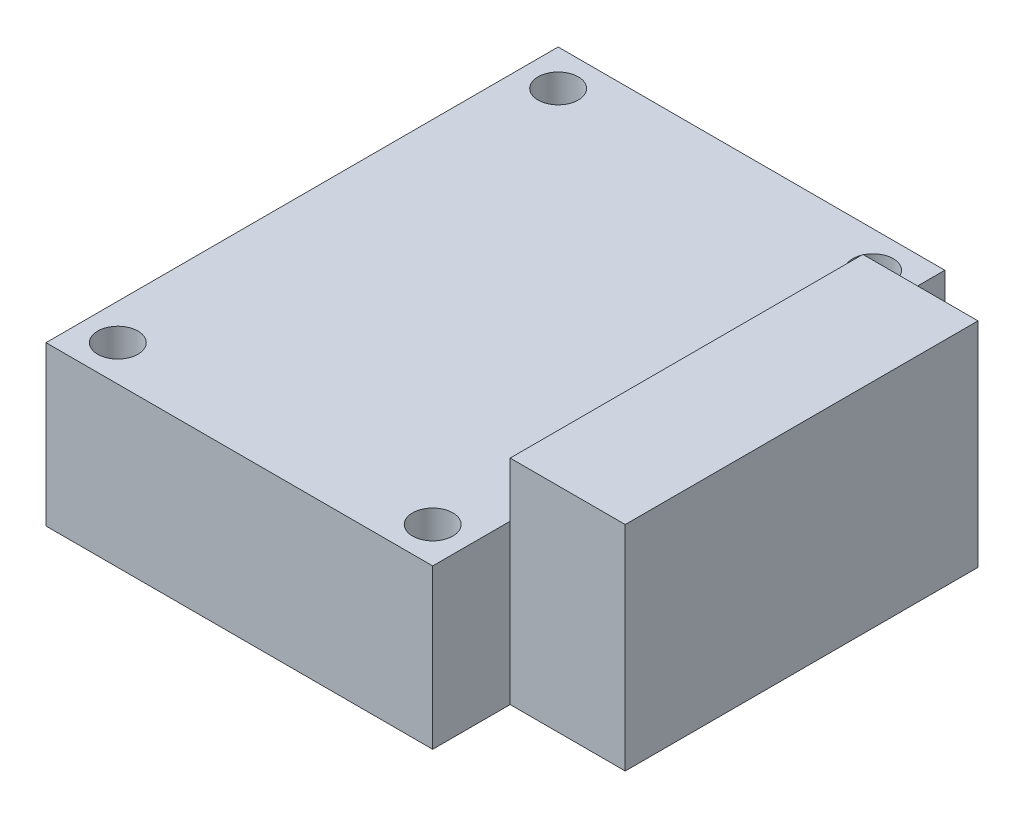
ISO-10303-21;
HEADER;
FILE_DESCRIPTION(('STEP AP214'),'2;1');
FILE_NAME('part.step','',(''),(''),'','','');
FILE_SCHEMA(('AUTOMOTIVE_DESIGN { 1 0 10303 214 1 1 1 1 }'));
ENDSEC;
DATA;
#1=APPLICATION_CONTEXT('core data for automotive mechanical design processes');
#2=APPLICATION_PROTOCOL_DEFINITION('international standard','automotive_design',2000,#1);
#3=PRODUCT_CONTEXT('',#1,'mechanical');
#4=PRODUCT('Part','Part','',(#3));
#5=PRODUCT_RELATED_PRODUCT_CATEGORY('part','',(#4));
#6=PRODUCT_DEFINITION_FORMATION('','',#4);
#7=PRODUCT_DEFINITION_CONTEXT('part definition',#1,'design');
#8=PRODUCT_DEFINITION('design','',#6,#7);
#9=PRODUCT_DEFINITION_SHAPE('','',#8);
#10=(LENGTH_UNIT() NAMED_UNIT(*) SI_UNIT(.MILLI.,.METRE.));
#11=(NAMED_UNIT(*) PLANE_ANGLE_UNIT() SI_UNIT($,.RADIAN.));
#12=(NAMED_UNIT(*) SI_UNIT($,.STERADIAN.) SOLID_ANGLE_UNIT());
#13=UNCERTAINTY_MEASURE_WITH_UNIT(LENGTH_MEASURE(1.E-05),#10,'distance_accuracy_value','');
#14=(GEOMETRIC_REPRESENTATION_CONTEXT(3) GLOBAL_UNCERTAINTY_ASSIGNED_CONTEXT((#13)) GLOBAL_UNIT_ASSIGNED_CONTEXT((#10,
#11,#12)) REPRESENTATION_CONTEXT('',''));
#15=CARTESIAN_POINT('',(0.,0.,0.));
#16=DIRECTION('',(0.,0.,1.));
#17=DIRECTION('',(1.,0.,0.));
#18=AXIS2_PLACEMENT_3D('',#15,#16,#17);
#19=CARTESIAN_POINT('',(16.8,13.8,22.25));
#20=DIRECTION('',(-1.,0.,0.));
#21=DIRECTION('',(0.,0.,1.));
#22=AXIS2_PLACEMENT_3D('',#19,#20,#21);
#23=PLANE('',#22);
#24=DIRECTION('',(0.,-1.,0.));
#25=VECTOR('',#24,1.);
#26=CARTESIAN_POINT('',(16.8,8.55,15.52));
#27=LINE('',#26,#25);
#28=CARTESIAN_POINT('',(16.8,13.8,15.52));
#29=VERTEX_POINT('',#28);
#30=CARTESIAN_POINT('',(16.8,0.,15.52));
#31=VERTEX_POINT('',#30);
#32=EDGE_CURVE('E137',#29,#31,#27,.T.);
#33=ORIENTED_EDGE('',*,*,#32,.F.);
#34=DIRECTION('',(0.,0.,-1.));
#35=VECTOR('',#34,1.);
#36=CARTESIAN_POINT('',(16.8,13.8,22.25));
#37=LINE('',#36,#35);
#38=CARTESIAN_POINT('',(16.8,13.8,22.25));
#39=VERTEX_POINT('',#38);
#40=EDGE_CURVE('E174',#39,#29,#37,.T.);
#41=ORIENTED_EDGE('',*,*,#40,.F.);
#42=DIRECTION('',(0.,-1.,0.));
#43=VECTOR('',#42,1.);
#44=CARTESIAN_POINT('',(16.8,13.8,22.25));
#45=LINE('',#44,#43);
#46=CARTESIAN_POINT('',(16.8,0.,22.25));
#47=VERTEX_POINT('',#46);
#48=EDGE_CURVE('E183',#39,#47,#45,.T.);
#49=ORIENTED_EDGE('',*,*,#48,.T.);
#50=DIRECTION('',(0.,0.,-1.));
#51=VECTOR('',#50,1.);
#52=CARTESIAN_POINT('',(16.8,0.,22.25));
#53=LINE('',#52,#51);
#54=EDGE_CURVE('E54',#47,#31,#53,.T.);
#55=ORIENTED_EDGE('',*,*,#54,.T.);
#56=EDGE_LOOP('',(#33,#41,#49,#55));
#57=FACE_BOUND('',#56,.T.);
#58=ADVANCED_FACE('F32',(#57),#23,.F.);
#59=CARTESIAN_POINT('',(16.8,13.8,-15.13));
#60=VERTEX_POINT('',#59);
#61=CARTESIAN_POINT('',(16.8,13.8,-22.25));
#62=VERTEX_POINT('',#61);
#63=EDGE_CURVE('E177',#60,#62,#37,.T.);
#64=ORIENTED_EDGE('',*,*,#63,.F.);
#65=DIRECTION('',(0.,1.,0.));
#66=VECTOR('',#65,1.);
#67=CARTESIAN_POINT('',(16.8,8.55,-15.13));
#68=LINE('',#67,#66);
#69=CARTESIAN_POINT('',(16.8,0.,-15.13));
#70=VERTEX_POINT('',#69);
#71=EDGE_CURVE('E46',#70,#60,#68,.T.);
#72=ORIENTED_EDGE('',*,*,#71,.F.);
#73=CARTESIAN_POINT('',(16.8,0.,-22.25));
#74=VERTEX_POINT('',#73);
#75=EDGE_CURVE('E171',#70,#74,#53,.T.);
#76=ORIENTED_EDGE('',*,*,#75,.T.);
#77=DIRECTION('',(0.,-1.,0.));
#78=VECTOR('',#77,1.);
#79=CARTESIAN_POINT('',(16.8,13.8,-22.25));
#80=LINE('',#79,#78);
#81=EDGE_CURVE('E11',#62,#74,#80,.T.);
#82=ORIENTED_EDGE('',*,*,#81,.F.);
#83=EDGE_LOOP('',(#64,#72,#76,#82));
#84=FACE_BOUND('',#83,.T.);
#85=ADVANCED_FACE('F218',(#84),#23,.F.);
#86=CARTESIAN_POINT('',(0.,13.8,0.));
#87=DIRECTION('',(0.,-1.,0.));
#88=DIRECTION('',(0.,0.,-1.));
#89=AXIS2_PLACEMENT_3D('',#86,#87,#88);
#90=PLANE('',#89);
#91=ORIENTED_EDGE('',*,*,#40,.T.);
#92=DIRECTION('',(0.,0.,1.));
#93=VECTOR('',#92,1.);
#94=CARTESIAN_POINT('',(16.8,13.8,0.));
#95=LINE('',#94,#93);
#96=EDGE_CURVE('E128',#60,#29,#95,.T.);
#97=ORIENTED_EDGE('',*,*,#96,.F.);
#98=ORIENTED_EDGE('',*,*,#63,.T.);
#99=DIRECTION('',(-1.,0.,0.));
#100=VECTOR('',#99,1.);
#101=CARTESIAN_POINT('',(-16.8,13.8,-22.25));
#102=LINE('',#101,#100);
#103=CARTESIAN_POINT('',(-16.8,13.8,-22.25));
#104=VERTEX_POINT('',#103);
#105=EDGE_CURVE('E176',#62,#104,#102,.T.);
#106=ORIENTED_EDGE('',*,*,#105,.T.);
#107=DIRECTION('',(0.,0.,1.));
#108=VECTOR('',#107,1.);
#109=CARTESIAN_POINT('',(-16.8,13.8,22.25));
#110=LINE('',#109,#108);
#111=CARTESIAN_POINT('',(-16.8,13.8,22.25));
#112=VERTEX_POINT('',#111);
#113=EDGE_CURVE('E179',#104,#112,#110,.T.);
#114=ORIENTED_EDGE('',*,*,#113,.T.);
#115=DIRECTION('',(1.,0.,0.));
#116=VECTOR('',#115,1.);
#117=CARTESIAN_POINT('',(-16.8,13.8,22.25));
#118=LINE('',#117,#116);
#119=EDGE_CURVE('E181',#112,#39,#118,.T.);
#120=ORIENTED_EDGE('',*,*,#119,.T.);
#121=EDGE_LOOP('',(#91,#97,#98,#106,#114,#120));
#122=FACE_BOUND('',#121,.T.);
#123=CARTESIAN_POINT('',(-13.68,13.8,-19.13));
#124=DIRECTION('',(0.,1.,0.));
#125=DIRECTION('',(0.,0.,1.));
#126=AXIS2_PLACEMENT_3D('',#123,#124,#125);
#127=CIRCLE('',#126,1.75);
#128=CARTESIAN_POINT('',(-13.68,13.8,-20.88));
#129=VERTEX_POINT('',#128);
#130=EDGE_CURVE('E168',#129,#129,#127,.T.);
#131=ORIENTED_EDGE('',*,*,#130,.F.);
#132=EDGE_LOOP('',(#131));
#133=FACE_BOUND('',#132,.T.);
#134=CARTESIAN_POINT('',(-13.68,13.8,19.13));
#135=DIRECTION('',(0.,1.,0.));
#136=DIRECTION('',(0.,0.,1.));
#137=AXIS2_PLACEMENT_3D('',#134,#135,#136);
#138=CIRCLE('',#137,1.75);
#139=CARTESIAN_POINT('',(-13.68,13.8,17.38));
#140=VERTEX_POINT('',#139);
#141=EDGE_CURVE('E162',#140,#140,#138,.T.);
#142=ORIENTED_EDGE('',*,*,#141,.F.);
#143=EDGE_LOOP('',(#142));
#144=FACE_BOUND('',#143,.T.);
#145=CARTESIAN_POINT('',(13.68,13.8,19.13));
#146=DIRECTION('',(0.,1.,0.));
#147=DIRECTION('',(0.,0.,1.));
#148=AXIS2_PLACEMENT_3D('',#145,#146,#147);
#149=CIRCLE('',#148,1.75);
#150=CARTESIAN_POINT('',(13.68,13.8,17.38));
#151=VERTEX_POINT('',#150);
#152=EDGE_CURVE('E156',#151,#151,#149,.T.);
#153=ORIENTED_EDGE('',*,*,#152,.F.);
#154=EDGE_LOOP('',(#153));
#155=FACE_BOUND('',#154,.T.);
#156=CARTESIAN_POINT('',(13.68,13.8,-19.13));
#157=DIRECTION('',(0.,1.,0.));
#158=DIRECTION('',(0.,0.,1.));
#159=AXIS2_PLACEMENT_3D('',#156,#157,#158);
#160=CIRCLE('',#159,1.75);
#161=CARTESIAN_POINT('',(13.68,13.8,-20.88));
#162=VERTEX_POINT('',#161);
#163=EDGE_CURVE('E150',#162,#162,#160,.T.);
#164=ORIENTED_EDGE('',*,*,#163,.F.);
#165=EDGE_LOOP('',(#164));
#166=FACE_BOUND('',#165,.T.);
#167=ADVANCED_FACE('F214',(#122,#133,#144,#155,#166),#90,.F.);
#168=CARTESIAN_POINT('',(0.,0.,0.));
#169=DIRECTION('',(0.,-1.,0.));
#170=DIRECTION('',(0.,0.,-1.));
#171=AXIS2_PLACEMENT_3D('',#168,#169,#170);
#172=PLANE('',#171);
#173=CARTESIAN_POINT('',(13.68,0.,19.13));
#174=DIRECTION('',(0.,1.,0.));
#175=DIRECTION('',(0.,0.,1.));
#176=AXIS2_PLACEMENT_3D('',#173,#174,#175);
#177=CIRCLE('',#176,1.75);
#178=CARTESIAN_POINT('',(13.68,0.,17.38));
#179=VERTEX_POINT('',#178);
#180=EDGE_CURVE('E153',#179,#179,#177,.T.);
#181=ORIENTED_EDGE('',*,*,#180,.T.);
#182=EDGE_LOOP('',(#181));
#183=FACE_BOUND('',#182,.T.);
#184=CARTESIAN_POINT('',(-13.68,0.,-19.13));
#185=DIRECTION('',(0.,1.,0.));
#186=DIRECTION('',(0.,0.,1.));
#187=AXIS2_PLACEMENT_3D('',#184,#185,#186);
#188=CIRCLE('',#187,1.75);
#189=CARTESIAN_POINT('',(-13.68,0.,-20.88));
#190=VERTEX_POINT('',#189);
#191=EDGE_CURVE('E165',#190,#190,#188,.T.);
#192=ORIENTED_EDGE('',*,*,#191,.T.);
#193=EDGE_LOOP('',(#192));
#194=FACE_BOUND('',#193,.T.);
#195=ORIENTED_EDGE('',*,*,#54,.F.);
#196=DIRECTION('',(1.,0.,0.));
#197=VECTOR('',#196,1.);
#198=CARTESIAN_POINT('',(-16.8,0.,22.25));
#199=LINE('',#198,#197);
#200=CARTESIAN_POINT('',(-16.8,0.,22.25));
#201=VERTEX_POINT('',#200);
#202=EDGE_CURVE('E189',#201,#47,#199,.T.);
#203=ORIENTED_EDGE('',*,*,#202,.F.);
#204=DIRECTION('',(0.,0.,1.));
#205=VECTOR('',#204,1.);
#206=CARTESIAN_POINT('',(-16.8,0.,22.25));
#207=LINE('',#206,#205);
#208=CARTESIAN_POINT('',(-16.8,0.,-22.25));
#209=VERTEX_POINT('',#208);
#210=EDGE_CURVE('E187',#209,#201,#207,.T.);
#211=ORIENTED_EDGE('',*,*,#210,.F.);
#212=DIRECTION('',(-1.,0.,0.));
#213=VECTOR('',#212,1.);
#214=CARTESIAN_POINT('',(-16.8,0.,-22.25));
#215=LINE('',#214,#213);
#216=EDGE_CURVE('E185',#74,#209,#215,.T.);
#217=ORIENTED_EDGE('',*,*,#216,.F.);
#218=ORIENTED_EDGE('',*,*,#75,.F.);
#219=DIRECTION('',(-1.,0.,0.));
#220=VECTOR('',#219,1.);
#221=CARTESIAN_POINT('',(26.8,0.,-15.13));
#222=LINE('',#221,#220);
#223=CARTESIAN_POINT('',(26.8,0.,-15.13));
#224=VERTEX_POINT('',#223);
#225=EDGE_CURVE('E141',#224,#70,#222,.T.);
#226=ORIENTED_EDGE('',*,*,#225,.F.);
#227=DIRECTION('',(0.,0.,-1.));
#228=VECTOR('',#227,1.);
#229=CARTESIAN_POINT('',(26.8,0.,15.52));
#230=LINE('',#229,#228);
#231=CARTESIAN_POINT('',(26.8,0.,15.52));
#232=VERTEX_POINT('',#231);
#233=EDGE_CURVE('E139',#232,#224,#230,.T.);
#234=ORIENTED_EDGE('',*,*,#233,.F.);
#235=DIRECTION('',(-1.,0.,0.));
#236=VECTOR('',#235,1.);
#237=CARTESIAN_POINT('',(26.8,0.,15.52));
#238=LINE('',#237,#236);
#239=EDGE_CURVE('E146',#232,#31,#238,.T.);
#240=ORIENTED_EDGE('',*,*,#239,.T.);
#241=EDGE_LOOP('',(#195,#203,#211,#217,#218,#226,#234,#240));
#242=FACE_BOUND('',#241,.T.);
#243=CARTESIAN_POINT('',(-13.68,0.,19.13));
#244=DIRECTION('',(0.,1.,0.));
#245=DIRECTION('',(0.,0.,1.));
#246=AXIS2_PLACEMENT_3D('',#243,#244,#245);
#247=CIRCLE('',#246,1.75);
#248=CARTESIAN_POINT('',(-13.68,0.,17.38));
#249=VERTEX_POINT('',#248);
#250=EDGE_CURVE('E159',#249,#249,#247,.T.);
#251=ORIENTED_EDGE('',*,*,#250,.T.);
#252=EDGE_LOOP('',(#251));
#253=FACE_BOUND('',#252,.T.);
#254=CARTESIAN_POINT('',(13.68,0.,-19.13));
#255=DIRECTION('',(0.,1.,0.));
#256=DIRECTION('',(0.,0.,1.));
#257=AXIS2_PLACEMENT_3D('',#254,#255,#256);
#258=CIRCLE('',#257,1.75);
#259=CARTESIAN_POINT('',(13.68,0.,-20.88));
#260=VERTEX_POINT('',#259);
#261=EDGE_CURVE('E149',#260,#260,#258,.T.);
#262=ORIENTED_EDGE('',*,*,#261,.T.);
#263=EDGE_LOOP('',(#262));
#264=FACE_BOUND('',#263,.T.);
#265=ADVANCED_FACE('F206',(#183,#194,#242,#253,#264),#172,.T.);
#266=CARTESIAN_POINT('',(-16.8,13.8,-22.25));
#267=DIRECTION('',(0.,0.,1.));
#268=DIRECTION('',(1.,0.,0.));
#269=AXIS2_PLACEMENT_3D('',#266,#267,#268);
#270=PLANE('',#269);
#271=ORIENTED_EDGE('',*,*,#216,.T.);
#272=DIRECTION('',(0.,-1.,0.));
#273=VECTOR('',#272,1.);
#274=CARTESIAN_POINT('',(-16.8,13.8,-22.25));
#275=LINE('',#274,#273);
#276=EDGE_CURVE('E39',#104,#209,#275,.T.);
#277=ORIENTED_EDGE('',*,*,#276,.F.);
#278=ORIENTED_EDGE('',*,*,#105,.F.);
#279=ORIENTED_EDGE('',*,*,#81,.T.);
#280=EDGE_LOOP('',(#271,#277,#278,#279));
#281=FACE_BOUND('',#280,.T.);
#282=ADVANCED_FACE('F217',(#281),#270,.F.);
#283=CARTESIAN_POINT('',(-16.8,13.8,22.25));
#284=DIRECTION('',(1.,0.,0.));
#285=DIRECTION('',(0.,0.,-1.));
#286=AXIS2_PLACEMENT_3D('',#283,#284,#285);
#287=PLANE('',#286);
#288=ORIENTED_EDGE('',*,*,#210,.T.);
#289=DIRECTION('',(0.,-1.,0.));
#290=VECTOR('',#289,1.);
#291=CARTESIAN_POINT('',(-16.8,13.8,22.25));
#292=LINE('',#291,#290);
#293=EDGE_CURVE('E192',#112,#201,#292,.T.);
#294=ORIENTED_EDGE('',*,*,#293,.F.);
#295=ORIENTED_EDGE('',*,*,#113,.F.);
#296=ORIENTED_EDGE('',*,*,#276,.T.);
#297=EDGE_LOOP('',(#288,#294,#295,#296));
#298=FACE_BOUND('',#297,.T.);
#299=ADVANCED_FACE('F199',(#298),#287,.F.);
#300=CARTESIAN_POINT('',(-16.8,13.8,22.25));
#301=DIRECTION('',(0.,0.,-1.));
#302=DIRECTION('',(-1.,0.,0.));
#303=AXIS2_PLACEMENT_3D('',#300,#301,#302);
#304=PLANE('',#303);
#305=ORIENTED_EDGE('',*,*,#202,.T.);
#306=ORIENTED_EDGE('',*,*,#48,.F.);
#307=ORIENTED_EDGE('',*,*,#119,.F.);
#308=ORIENTED_EDGE('',*,*,#293,.T.);
#309=EDGE_LOOP('',(#305,#306,#307,#308));
#310=FACE_BOUND('',#309,.T.);
#311=ADVANCED_FACE('F210',(#310),#304,.F.);
#312=CARTESIAN_POINT('',(-13.68,13.8,-19.13));
#313=DIRECTION('',(0.,-1.,0.));
#314=DIRECTION('',(0.,0.,-1.));
#315=AXIS2_PLACEMENT_3D('',#312,#313,#314);
#316=CYLINDRICAL_SURFACE('',#315,1.75);
#317=CARTESIAN_POINT('',(-13.68,13.8,-20.88));
#318=CARTESIAN_POINT('',(-13.68,13.65625,-20.88));
#319=CARTESIAN_POINT('',(-13.68,13.5125,-20.88));
#320=CARTESIAN_POINT('',(-13.68,13.225,-20.88));
#321=CARTESIAN_POINT('',(-13.68,13.08125,-20.88));
#322=CARTESIAN_POINT('',(-13.68,12.79375,-20.88));
#323=CARTESIAN_POINT('',(-13.68,12.65,-20.88));
#324=CARTESIAN_POINT('',(-13.68,12.3625,-20.88));
#325=CARTESIAN_POINT('',(-13.68,12.21875,-20.88));
#326=CARTESIAN_POINT('',(-13.68,11.93125,-20.88));
#327=CARTESIAN_POINT('',(-13.68,11.7875,-20.88));
#328=CARTESIAN_POINT('',(-13.68,11.5,-20.88));
#329=CARTESIAN_POINT('',(-13.68,11.35625,-20.88));
#330=CARTESIAN_POINT('',(-13.68,11.06875,-20.88));
#331=CARTESIAN_POINT('',(-13.68,10.925,-20.88));
#332=CARTESIAN_POINT('',(-13.68,10.6375,-20.88));
#333=CARTESIAN_POINT('',(-13.68,10.49375,-20.88));
#334=CARTESIAN_POINT('',(-13.68,10.20625,-20.88));
#335=CARTESIAN_POINT('',(-13.68,10.0625,-20.88));
#336=CARTESIAN_POINT('',(-13.68,9.775,-20.88));
#337=CARTESIAN_POINT('',(-13.68,9.63125,-20.88));
#338=CARTESIAN_POINT('',(-13.68,9.34375,-20.88));
#339=CARTESIAN_POINT('',(-13.68,9.2,-20.88));
#340=CARTESIAN_POINT('',(-13.68,8.9125,-20.88));
#341=CARTESIAN_POINT('',(-13.68,8.76875,-20.88));
#342=CARTESIAN_POINT('',(-13.68,8.48125,-20.88));
#343=CARTESIAN_POINT('',(-13.68,8.3375,-20.88));
#344=CARTESIAN_POINT('',(-13.68,8.05,-20.88));
#345=CARTESIAN_POINT('',(-13.68,7.90625,-20.88));
#346=CARTESIAN_POINT('',(-13.68,7.61875,-20.88));
#347=CARTESIAN_POINT('',(-13.68,7.475,-20.88));
#348=CARTESIAN_POINT('',(-13.68,7.1875,-20.88));
#349=CARTESIAN_POINT('',(-13.68,7.04375,-20.88));
#350=CARTESIAN_POINT('',(-13.68,6.75625,-20.88));
#351=CARTESIAN_POINT('',(-13.68,6.6125,-20.88));
#352=CARTESIAN_POINT('',(-13.68,6.325,-20.88));
#353=CARTESIAN_POINT('',(-13.68,6.18125,-20.88));
#354=CARTESIAN_POINT('',(-13.68,5.89375,-20.88));
#355=CARTESIAN_POINT('',(-13.68,5.75,-20.88));
#356=CARTESIAN_POINT('',(-13.68,5.4625,-20.88));
#357=CARTESIAN_POINT('',(-13.68,5.31875,-20.88));
#358=CARTESIAN_POINT('',(-13.68,5.03125,-20.88));
#359=CARTESIAN_POINT('',(-13.68,4.8875,-20.88));
#360=CARTESIAN_POINT('',(-13.68,4.6,-20.88));
#361=CARTESIAN_POINT('',(-13.68,4.45625,-20.88));
#362=CARTESIAN_POINT('',(-13.68,4.16875,-20.88));
#363=CARTESIAN_POINT('',(-13.68,4.025,-20.88));
#364=CARTESIAN_POINT('',(-13.68,3.7375,-20.88));
#365=CARTESIAN_POINT('',(-13.68,3.59375,-20.88));
#366=CARTESIAN_POINT('',(-13.68,3.30625,-20.88));
#367=CARTESIAN_POINT('',(-13.68,3.1625,-20.88));
#368=CARTESIAN_POINT('',(-13.68,2.875,-20.88));
#369=CARTESIAN_POINT('',(-13.68,2.73125,-20.88));
#370=CARTESIAN_POINT('',(-13.68,2.44375,-20.88));
#371=CARTESIAN_POINT('',(-13.68,2.3,-20.88));
#372=CARTESIAN_POINT('',(-13.68,2.0125,-20.88));
#373=CARTESIAN_POINT('',(-13.68,1.86875,-20.88));
#374=CARTESIAN_POINT('',(-13.68,1.58125,-20.88));
#375=CARTESIAN_POINT('',(-13.68,1.4375,-20.88));
#376=CARTESIAN_POINT('',(-13.68,1.15,-20.88));
#377=CARTESIAN_POINT('',(-13.68,1.00625,-20.88));
#378=CARTESIAN_POINT('',(-13.68,0.71875,-20.88));
#379=CARTESIAN_POINT('',(-13.68,0.575,-20.88));
#380=CARTESIAN_POINT('',(-13.68,0.2875,-20.88));
#381=CARTESIAN_POINT('',(-13.68,0.14375,-20.88));
#382=CARTESIAN_POINT('',(-13.68,0.,-20.88));
#383=B_SPLINE_CURVE_WITH_KNOTS('',3,(#317,#318,#319,#320,#321,#322,#323,#324,#325,#326,#327,
#328,#329,#330,#331,#332,#333,#334,#335,#336,#337,#338,#339,#340,#341,#342,#343,#344,#345,#346,
#347,#348,#349,#350,#351,#352,#353,#354,#355,#356,#357,#358,#359,#360,#361,#362,#363,#364,#365,
#366,#367,#368,#369,#370,#371,#372,#373,#374,#375,#376,#377,#378,#379,#380,#381,#382),
.UNSPECIFIED.,.F.,.F.,(4,2,2,2,2,2,2,2,2,2,2,2,2,2,2,2,2,2,2,2,2,2,2,2,2,2,2,2,2,2,2,2,4),(0.,
0.431250000000001,0.8625,1.29375,1.725,2.15625,2.5875,3.01875,3.45,3.88125,4.3125,4.74375,5.175,
5.60625,6.0375,6.46875,6.9,7.33125,7.7625,8.19375,8.625,9.05625,9.4875,9.91875,10.35,10.78125,
11.2125,11.64375,12.075,12.50625,12.9375,13.36875,13.8),.UNSPECIFIED.);
#384=EDGE_CURVE('BSEAM249',#129,#190,#383,.T.);
#385=ORIENTED_EDGE('',*,*,#130,.T.);
#386=ORIENTED_EDGE('',*,*,#191,.F.);
#387=ORIENTED_EDGE('',*,*,#384,.T.);
#388=ORIENTED_EDGE('',*,*,#384,.F.);
#389=EDGE_LOOP('',(#385,#387,#386,#388));
#390=FACE_BOUND('',#389,.T.);
#391=ADVANCED_FACE('F249',(#390),#316,.F.);
#392=CARTESIAN_POINT('',(-13.68,13.8,19.13));
#393=DIRECTION('',(0.,-1.,0.));
#394=DIRECTION('',(0.,0.,-1.));
#395=AXIS2_PLACEMENT_3D('',#392,#393,#394);
#396=CYLINDRICAL_SURFACE('',#395,1.75);
#397=CARTESIAN_POINT('',(-13.68,13.8,17.38));
#398=CARTESIAN_POINT('',(-13.68,13.65625,17.38));
#399=CARTESIAN_POINT('',(-13.68,13.5125,17.38));
#400=CARTESIAN_POINT('',(-13.68,13.225,17.38));
#401=CARTESIAN_POINT('',(-13.68,13.08125,17.38));
#402=CARTESIAN_POINT('',(-13.68,12.79375,17.38));
#403=CARTESIAN_POINT('',(-13.68,12.65,17.38));
#404=CARTESIAN_POINT('',(-13.68,12.3625,17.38));
#405=CARTESIAN_POINT('',(-13.68,12.21875,17.38));
#406=CARTESIAN_POINT('',(-13.68,11.93125,17.38));
#407=CARTESIAN_POINT('',(-13.68,11.7875,17.38));
#408=CARTESIAN_POINT('',(-13.68,11.5,17.38));
#409=CARTESIAN_POINT('',(-13.68,11.35625,17.38));
#410=CARTESIAN_POINT('',(-13.68,11.06875,17.38));
#411=CARTESIAN_POINT('',(-13.68,10.925,17.38));
#412=CARTESIAN_POINT('',(-13.68,10.6375,17.38));
#413=CARTESIAN_POINT('',(-13.68,10.49375,17.38));
#414=CARTESIAN_POINT('',(-13.68,10.20625,17.38));
#415=CARTESIAN_POINT('',(-13.68,10.0625,17.38));
#416=CARTESIAN_POINT('',(-13.68,9.775,17.38));
#417=CARTESIAN_POINT('',(-13.68,9.63125,17.38));
#418=CARTESIAN_POINT('',(-13.68,9.34375,17.38));
#419=CARTESIAN_POINT('',(-13.68,9.2,17.38));
#420=CARTESIAN_POINT('',(-13.68,8.9125,17.38));
#421=CARTESIAN_POINT('',(-13.68,8.76875,17.38));
#422=CARTESIAN_POINT('',(-13.68,8.48125,17.38));
#423=CARTESIAN_POINT('',(-13.68,8.3375,17.38));
#424=CARTESIAN_POINT('',(-13.68,8.05,17.38));
#425=CARTESIAN_POINT('',(-13.68,7.90625,17.38));
#426=CARTESIAN_POINT('',(-13.68,7.61875,17.38));
#427=CARTESIAN_POINT('',(-13.68,7.475,17.38));
#428=CARTESIAN_POINT('',(-13.68,7.1875,17.38));
#429=CARTESIAN_POINT('',(-13.68,7.04375,17.38));
#430=CARTESIAN_POINT('',(-13.68,6.75625,17.38));
#431=CARTESIAN_POINT('',(-13.68,6.6125,17.38));
#432=CARTESIAN_POINT('',(-13.68,6.325,17.38));
#433=CARTESIAN_POINT('',(-13.68,6.18125,17.38));
#434=CARTESIAN_POINT('',(-13.68,5.89375,17.38));
#435=CARTESIAN_POINT('',(-13.68,5.75,17.38));
#436=CARTESIAN_POINT('',(-13.68,5.4625,17.38));
#437=CARTESIAN_POINT('',(-13.68,5.31875,17.38));
#438=CARTESIAN_POINT('',(-13.68,5.03125,17.38));
#439=CARTESIAN_POINT('',(-13.68,4.8875,17.38));
#440=CARTESIAN_POINT('',(-13.68,4.6,17.38));
#441=CARTESIAN_POINT('',(-13.68,4.45625,17.38));
#442=CARTESIAN_POINT('',(-13.68,4.16875,17.38));
#443=CARTESIAN_POINT('',(-13.68,4.025,17.38));
#444=CARTESIAN_POINT('',(-13.68,3.7375,17.38));
#445=CARTESIAN_POINT('',(-13.68,3.59375,17.38));
#446=CARTESIAN_POINT('',(-13.68,3.30625,17.38));
#447=CARTESIAN_POINT('',(-13.68,3.1625,17.38));
#448=CARTESIAN_POINT('',(-13.68,2.875,17.38));
#449=CARTESIAN_POINT('',(-13.68,2.73125,17.38));
#450=CARTESIAN_POINT('',(-13.68,2.44375,17.38));
#451=CARTESIAN_POINT('',(-13.68,2.3,17.38));
#452=CARTESIAN_POINT('',(-13.68,2.0125,17.38));
#453=CARTESIAN_POINT('',(-13.68,1.86875,17.38));
#454=CARTESIAN_POINT('',(-13.68,1.58125,17.38));
#455=CARTESIAN_POINT('',(-13.68,1.4375,17.38));
#456=CARTESIAN_POINT('',(-13.68,1.15,17.38));
#457=CARTESIAN_POINT('',(-13.68,1.00625,17.38));
#458=CARTESIAN_POINT('',(-13.68,0.71875,17.38));
#459=CARTESIAN_POINT('',(-13.68,0.575,17.38));
#460=CARTESIAN_POINT('',(-13.68,0.2875,17.38));
#461=CARTESIAN_POINT('',(-13.68,0.14375,17.38));
#462=CARTESIAN_POINT('',(-13.68,0.,17.38));
#463=B_SPLINE_CURVE_WITH_KNOTS('',3,(#397,#398,#399,#400,#401,#402,#403,#404,#405,#406,#407,
#408,#409,#410,#411,#412,#413,#414,#415,#416,#417,#418,#419,#420,#421,#422,#423,#424,#425,#426,
#427,#428,#429,#430,#431,#432,#433,#434,#435,#436,#437,#438,#439,#440,#441,#442,#443,#444,#445,
#446,#447,#448,#449,#450,#451,#452,#453,#454,#455,#456,#457,#458,#459,#460,#461,#462),
.UNSPECIFIED.,.F.,.F.,(4,2,2,2,2,2,2,2,2,2,2,2,2,2,2,2,2,2,2,2,2,2,2,2,2,2,2,2,2,2,2,2,4),(0.,
0.431250000000001,0.8625,1.29375,1.725,2.15625,2.5875,3.01875,3.45,3.88125,4.3125,4.74375,5.175,
5.60625,6.0375,6.46875,6.9,7.33125,7.7625,8.19375,8.625,9.05625,9.4875,9.91875,10.35,10.78125,
11.2125,11.64375,12.075,12.50625,12.9375,13.36875,13.8),.UNSPECIFIED.);
#464=EDGE_CURVE('BSEAM274',#140,#249,#463,.T.);
#465=ORIENTED_EDGE('',*,*,#141,.T.);
#466=ORIENTED_EDGE('',*,*,#250,.F.);
#467=ORIENTED_EDGE('',*,*,#464,.T.);
#468=ORIENTED_EDGE('',*,*,#464,.F.);
#469=EDGE_LOOP('',(#465,#467,#466,#468));
#470=FACE_BOUND('',#469,.T.);
#471=ADVANCED_FACE('F274',(#470),#396,.F.);
#472=CARTESIAN_POINT('',(13.68,13.8,19.13));
#473=DIRECTION('',(0.,-1.,0.));
#474=DIRECTION('',(0.,0.,-1.));
#475=AXIS2_PLACEMENT_3D('',#472,#473,#474);
#476=CYLINDRICAL_SURFACE('',#475,1.75);
#477=CARTESIAN_POINT('',(13.68,13.8,17.38));
#478=CARTESIAN_POINT('',(13.68,13.65625,17.38));
#479=CARTESIAN_POINT('',(13.68,13.5125,17.38));
#480=CARTESIAN_POINT('',(13.68,13.225,17.38));
#481=CARTESIAN_POINT('',(13.68,13.08125,17.38));
#482=CARTESIAN_POINT('',(13.68,12.79375,17.38));
#483=CARTESIAN_POINT('',(13.68,12.65,17.38));
#484=CARTESIAN_POINT('',(13.68,12.3625,17.38));
#485=CARTESIAN_POINT('',(13.68,12.21875,17.38));
#486=CARTESIAN_POINT('',(13.68,11.93125,17.38));
#487=CARTESIAN_POINT('',(13.68,11.7875,17.38));
#488=CARTESIAN_POINT('',(13.68,11.5,17.38));
#489=CARTESIAN_POINT('',(13.68,11.35625,17.38));
#490=CARTESIAN_POINT('',(13.68,11.06875,17.38));
#491=CARTESIAN_POINT('',(13.68,10.925,17.38));
#492=CARTESIAN_POINT('',(13.68,10.6375,17.38));
#493=CARTESIAN_POINT('',(13.68,10.49375,17.38));
#494=CARTESIAN_POINT('',(13.68,10.20625,17.38));
#495=CARTESIAN_POINT('',(13.68,10.0625,17.38));
#496=CARTESIAN_POINT('',(13.68,9.775,17.38));
#497=CARTESIAN_POINT('',(13.68,9.63125,17.38));
#498=CARTESIAN_POINT('',(13.68,9.34375,17.38));
#499=CARTESIAN_POINT('',(13.68,9.2,17.38));
#500=CARTESIAN_POINT('',(13.68,8.9125,17.38));
#501=CARTESIAN_POINT('',(13.68,8.76875,17.38));
#502=CARTESIAN_POINT('',(13.68,8.48125,17.38));
#503=CARTESIAN_POINT('',(13.68,8.3375,17.38));
#504=CARTESIAN_POINT('',(13.68,8.05,17.38));
#505=CARTESIAN_POINT('',(13.68,7.90625,17.38));
#506=CARTESIAN_POINT('',(13.68,7.61875,17.38));
#507=CARTESIAN_POINT('',(13.68,7.475,17.38));
#508=CARTESIAN_POINT('',(13.68,7.1875,17.38));
#509=CARTESIAN_POINT('',(13.68,7.04375,17.38));
#510=CARTESIAN_POINT('',(13.68,6.75625,17.38));
#511=CARTESIAN_POINT('',(13.68,6.6125,17.38));
#512=CARTESIAN_POINT('',(13.68,6.325,17.38));
#513=CARTESIAN_POINT('',(13.68,6.18125,17.38));
#514=CARTESIAN_POINT('',(13.68,5.89375,17.38));
#515=CARTESIAN_POINT('',(13.68,5.75,17.38));
#516=CARTESIAN_POINT('',(13.68,5.4625,17.38));
#517=CARTESIAN_POINT('',(13.68,5.31875,17.38));
#518=CARTESIAN_POINT('',(13.68,5.03125,17.38));
#519=CARTESIAN_POINT('',(13.68,4.8875,17.38));
#520=CARTESIAN_POINT('',(13.68,4.6,17.38));
#521=CARTESIAN_POINT('',(13.68,4.45625,17.38));
#522=CARTESIAN_POINT('',(13.68,4.16875,17.38));
#523=CARTESIAN_POINT('',(13.68,4.025,17.38));
#524=CARTESIAN_POINT('',(13.68,3.7375,17.38));
#525=CARTESIAN_POINT('',(13.68,3.59375,17.38));
#526=CARTESIAN_POINT('',(13.68,3.30625,17.38));
#527=CARTESIAN_POINT('',(13.68,3.1625,17.38));
#528=CARTESIAN_POINT('',(13.68,2.875,17.38));
#529=CARTESIAN_POINT('',(13.68,2.73125,17.38));
#530=CARTESIAN_POINT('',(13.68,2.44375,17.38));
#531=CARTESIAN_POINT('',(13.68,2.3,17.38));
#532=CARTESIAN_POINT('',(13.68,2.0125,17.38));
#533=CARTESIAN_POINT('',(13.68,1.86875,17.38));
#534=CARTESIAN_POINT('',(13.68,1.58125,17.38));
#535=CARTESIAN_POINT('',(13.68,1.4375,17.38));
#536=CARTESIAN_POINT('',(13.68,1.15,17.38));
#537=CARTESIAN_POINT('',(13.68,1.00625,17.38));
#538=CARTESIAN_POINT('',(13.68,0.71875,17.38));
#539=CARTESIAN_POINT('',(13.68,0.575,17.38));
#540=CARTESIAN_POINT('',(13.68,0.2875,17.38));
#541=CARTESIAN_POINT('',(13.68,0.14375,17.38));
#542=CARTESIAN_POINT('',(13.68,0.,17.38));
#543=B_SPLINE_CURVE_WITH_KNOTS('',3,(#477,#478,#479,#480,#481,#482,#483,#484,#485,#486,#487,
#488,#489,#490,#491,#492,#493,#494,#495,#496,#497,#498,#499,#500,#501,#502,#503,#504,#505,#506,
#507,#508,#509,#510,#511,#512,#513,#514,#515,#516,#517,#518,#519,#520,#521,#522,#523,#524,#525,
#526,#527,#528,#529,#530,#531,#532,#533,#534,#535,#536,#537,#538,#539,#540,#541,#542),
.UNSPECIFIED.,.F.,.F.,(4,2,2,2,2,2,2,2,2,2,2,2,2,2,2,2,2,2,2,2,2,2,2,2,2,2,2,2,2,2,2,2,4),(0.,
0.431250000000001,0.8625,1.29375,1.725,2.15625,2.5875,3.01875,3.45,3.88125,4.3125,4.74375,5.175,
5.60625,6.0375,6.46875,6.9,7.33125,7.7625,8.19375,8.625,9.05625,9.4875,9.91875,10.35,10.78125,
11.2125,11.64375,12.075,12.50625,12.9375,13.36875,13.8),.UNSPECIFIED.);
#544=EDGE_CURVE('BSEAM281',#151,#179,#543,.T.);
#545=ORIENTED_EDGE('',*,*,#152,.T.);
#546=ORIENTED_EDGE('',*,*,#180,.F.);
#547=ORIENTED_EDGE('',*,*,#544,.T.);
#548=ORIENTED_EDGE('',*,*,#544,.F.);
#549=EDGE_LOOP('',(#545,#547,#546,#548));
#550=FACE_BOUND('',#549,.T.);
#551=ADVANCED_FACE('F281',(#550),#476,.F.);
#552=CARTESIAN_POINT('',(13.68,13.8,-19.13));
#553=DIRECTION('',(0.,-1.,0.));
#554=DIRECTION('',(0.,0.,-1.));
#555=AXIS2_PLACEMENT_3D('',#552,#553,#554);
#556=CYLINDRICAL_SURFACE('',#555,1.75);
#557=CARTESIAN_POINT('',(13.68,13.8,-20.88));
#558=CARTESIAN_POINT('',(13.68,13.65625,-20.88));
#559=CARTESIAN_POINT('',(13.68,13.5125,-20.88));
#560=CARTESIAN_POINT('',(13.68,13.225,-20.88));
#561=CARTESIAN_POINT('',(13.68,13.08125,-20.88));
#562=CARTESIAN_POINT('',(13.68,12.79375,-20.88));
#563=CARTESIAN_POINT('',(13.68,12.65,-20.88));
#564=CARTESIAN_POINT('',(13.68,12.3625,-20.88));
#565=CARTESIAN_POINT('',(13.68,12.21875,-20.88));
#566=CARTESIAN_POINT('',(13.68,11.93125,-20.88));
#567=CARTESIAN_POINT('',(13.68,11.7875,-20.88));
#568=CARTESIAN_POINT('',(13.68,11.5,-20.88));
#569=CARTESIAN_POINT('',(13.68,11.35625,-20.88));
#570=CARTESIAN_POINT('',(13.68,11.06875,-20.88));
#571=CARTESIAN_POINT('',(13.68,10.925,-20.88));
#572=CARTESIAN_POINT('',(13.68,10.6375,-20.88));
#573=CARTESIAN_POINT('',(13.68,10.49375,-20.88));
#574=CARTESIAN_POINT('',(13.68,10.20625,-20.88));
#575=CARTESIAN_POINT('',(13.68,10.0625,-20.88));
#576=CARTESIAN_POINT('',(13.68,9.775,-20.88));
#577=CARTESIAN_POINT('',(13.68,9.63125,-20.88));
#578=CARTESIAN_POINT('',(13.68,9.34375,-20.88));
#579=CARTESIAN_POINT('',(13.68,9.2,-20.88));
#580=CARTESIAN_POINT('',(13.68,8.9125,-20.88));
#581=CARTESIAN_POINT('',(13.68,8.76875,-20.88));
#582=CARTESIAN_POINT('',(13.68,8.48125,-20.88));
#583=CARTESIAN_POINT('',(13.68,8.3375,-20.88));
#584=CARTESIAN_POINT('',(13.68,8.05,-20.88));
#585=CARTESIAN_POINT('',(13.68,7.90625,-20.88));
#586=CARTESIAN_POINT('',(13.68,7.61875,-20.88));
#587=CARTESIAN_POINT('',(13.68,7.475,-20.88));
#588=CARTESIAN_POINT('',(13.68,7.1875,-20.88));
#589=CARTESIAN_POINT('',(13.68,7.04375,-20.88));
#590=CARTESIAN_POINT('',(13.68,6.75625,-20.88));
#591=CARTESIAN_POINT('',(13.68,6.6125,-20.88));
#592=CARTESIAN_POINT('',(13.68,6.325,-20.88));
#593=CARTESIAN_POINT('',(13.68,6.18125,-20.88));
#594=CARTESIAN_POINT('',(13.68,5.89375,-20.88));
#595=CARTESIAN_POINT('',(13.68,5.75,-20.88));
#596=CARTESIAN_POINT('',(13.68,5.4625,-20.88));
#597=CARTESIAN_POINT('',(13.68,5.31875,-20.88));
#598=CARTESIAN_POINT('',(13.68,5.03125,-20.88));
#599=CARTESIAN_POINT('',(13.68,4.8875,-20.88));
#600=CARTESIAN_POINT('',(13.68,4.6,-20.88));
#601=CARTESIAN_POINT('',(13.68,4.45625,-20.88));
#602=CARTESIAN_POINT('',(13.68,4.16875,-20.88));
#603=CARTESIAN_POINT('',(13.68,4.025,-20.88));
#604=CARTESIAN_POINT('',(13.68,3.7375,-20.88));
#605=CARTESIAN_POINT('',(13.68,3.59375,-20.88));
#606=CARTESIAN_POINT('',(13.68,3.30625,-20.88));
#607=CARTESIAN_POINT('',(13.68,3.1625,-20.88));
#608=CARTESIAN_POINT('',(13.68,2.875,-20.88));
#609=CARTESIAN_POINT('',(13.68,2.73125,-20.88));
#610=CARTESIAN_POINT('',(13.68,2.44375,-20.88));
#611=CARTESIAN_POINT('',(13.68,2.3,-20.88));
#612=CARTESIAN_POINT('',(13.68,2.0125,-20.88));
#613=CARTESIAN_POINT('',(13.68,1.86875,-20.88));
#614=CARTESIAN_POINT('',(13.68,1.58125,-20.88));
#615=CARTESIAN_POINT('',(13.68,1.4375,-20.88));
#616=CARTESIAN_POINT('',(13.68,1.15,-20.88));
#617=CARTESIAN_POINT('',(13.68,1.00625,-20.88));
#618=CARTESIAN_POINT('',(13.68,0.71875,-20.88));
#619=CARTESIAN_POINT('',(13.68,0.575,-20.88));
#620=CARTESIAN_POINT('',(13.68,0.2875,-20.88));
#621=CARTESIAN_POINT('',(13.68,0.14375,-20.88));
#622=CARTESIAN_POINT('',(13.68,0.,-20.88));
#623=B_SPLINE_CURVE_WITH_KNOTS('',3,(#557,#558,#559,#560,#561,#562,#563,#564,#565,#566,#567,
#568,#569,#570,#571,#572,#573,#574,#575,#576,#577,#578,#579,#580,#581,#582,#583,#584,#585,#586,
#587,#588,#589,#590,#591,#592,#593,#594,#595,#596,#597,#598,#599,#600,#601,#602,#603,#604,#605,
#606,#607,#608,#609,#610,#611,#612,#613,#614,#615,#616,#617,#618,#619,#620,#621,#622),
.UNSPECIFIED.,.F.,.F.,(4,2,2,2,2,2,2,2,2,2,2,2,2,2,2,2,2,2,2,2,2,2,2,2,2,2,2,2,2,2,2,2,4),(0.,
0.431250000000001,0.8625,1.29375,1.725,2.15625,2.5875,3.01875,3.45,3.88125,4.3125,4.74375,5.175,
5.60625,6.0375,6.46875,6.9,7.33125,7.7625,8.19375,8.625,9.05625,9.4875,9.91875,10.35,10.78125,
11.2125,11.64375,12.075,12.50625,12.9375,13.36875,13.8),.UNSPECIFIED.);
#624=EDGE_CURVE('BSEAM288',#162,#260,#623,.T.);
#625=ORIENTED_EDGE('',*,*,#163,.T.);
#626=ORIENTED_EDGE('',*,*,#261,.F.);
#627=ORIENTED_EDGE('',*,*,#624,.T.);
#628=ORIENTED_EDGE('',*,*,#624,.F.);
#629=EDGE_LOOP('',(#625,#627,#626,#628));
#630=FACE_BOUND('',#629,.T.);
#631=ADVANCED_FACE('F288',(#630),#556,.F.);
#632=CARTESIAN_POINT('',(26.8,8.55,-15.13));
#633=DIRECTION('',(0.,0.,1.));
#634=DIRECTION('',(1.,0.,0.));
#635=AXIS2_PLACEMENT_3D('',#632,#633,#634);
#636=PLANE('',#635);
#637=ORIENTED_EDGE('',*,*,#71,.T.);
#638=DIRECTION('',(0.,-1.,0.));
#639=VECTOR('',#638,1.);
#640=CARTESIAN_POINT('',(16.8,18.55,-15.13));
#641=LINE('',#640,#639);
#642=CARTESIAN_POINT('',(16.8,18.55,-15.13));
#643=VERTEX_POINT('',#642);
#644=EDGE_CURVE('E129',#643,#60,#641,.T.);
#645=ORIENTED_EDGE('',*,*,#644,.F.);
#646=DIRECTION('',(-1.,0.,0.));
#647=VECTOR('',#646,1.);
#648=CARTESIAN_POINT('',(16.8,18.55,-15.13));
#649=LINE('',#648,#647);
#650=CARTESIAN_POINT('',(26.8,18.55,-15.13));
#651=VERTEX_POINT('',#650);
#652=EDGE_CURVE('E120',#651,#643,#649,.T.);
#653=ORIENTED_EDGE('',*,*,#652,.F.);
#654=DIRECTION('',(0.,1.,0.));
#655=VECTOR('',#654,1.);
#656=CARTESIAN_POINT('',(26.8,8.55,-15.13));
#657=LINE('',#656,#655);
#658=EDGE_CURVE('E135',#224,#651,#657,.T.);
#659=ORIENTED_EDGE('',*,*,#658,.F.);
#660=ORIENTED_EDGE('',*,*,#225,.T.);
#661=EDGE_LOOP('',(#637,#645,#653,#659,#660));
#662=FACE_BOUND('',#661,.T.);
#663=ADVANCED_FACE('F223',(#662),#636,.F.);
#664=CARTESIAN_POINT('',(26.8,8.55,15.52));
#665=DIRECTION('',(0.,0.,-1.));
#666=DIRECTION('',(-1.,0.,0.));
#667=AXIS2_PLACEMENT_3D('',#664,#665,#666);
#668=PLANE('',#667);
#669=ORIENTED_EDGE('',*,*,#32,.T.);
#670=ORIENTED_EDGE('',*,*,#239,.F.);
#671=DIRECTION('',(0.,-1.,0.));
#672=VECTOR('',#671,1.);
#673=CARTESIAN_POINT('',(26.8,8.55,15.52));
#674=LINE('',#673,#672);
#675=CARTESIAN_POINT('',(26.8,18.55,15.52));
#676=VERTEX_POINT('',#675);
#677=EDGE_CURVE('E110',#676,#232,#674,.T.);
#678=ORIENTED_EDGE('',*,*,#677,.F.);
#679=DIRECTION('',(1.,0.,0.));
#680=VECTOR('',#679,1.);
#681=CARTESIAN_POINT('',(16.8,18.55,15.52));
#682=LINE('',#681,#680);
#683=CARTESIAN_POINT('',(16.8,18.55,15.52));
#684=VERTEX_POINT('',#683);
#685=EDGE_CURVE('E103',#684,#676,#682,.T.);
#686=ORIENTED_EDGE('',*,*,#685,.F.);
#687=DIRECTION('',(0.,-1.,0.));
#688=VECTOR('',#687,1.);
#689=CARTESIAN_POINT('',(16.8,18.55,15.52));
#690=LINE('',#689,#688);
#691=EDGE_CURVE('E107',#684,#29,#690,.T.);
#692=ORIENTED_EDGE('',*,*,#691,.T.);
#693=EDGE_LOOP('',(#669,#670,#678,#686,#692));
#694=FACE_BOUND('',#693,.T.);
#695=ADVANCED_FACE('F105',(#694),#668,.F.);
#696=CARTESIAN_POINT('',(26.8,0.,0.));
#697=DIRECTION('',(1.,0.,0.));
#698=DIRECTION('',(0.,0.,-1.));
#699=AXIS2_PLACEMENT_3D('',#696,#697,#698);
#700=PLANE('',#699);
#701=ORIENTED_EDGE('',*,*,#658,.T.);
#702=DIRECTION('',(0.,0.,-1.));
#703=VECTOR('',#702,1.);
#704=CARTESIAN_POINT('',(26.8,18.55,-15.13));
#705=LINE('',#704,#703);
#706=EDGE_CURVE('E114',#676,#651,#705,.T.);
#707=ORIENTED_EDGE('',*,*,#706,.F.);
#708=ORIENTED_EDGE('',*,*,#677,.T.);
#709=ORIENTED_EDGE('',*,*,#233,.T.);
#710=EDGE_LOOP('',(#701,#707,#708,#709));
#711=FACE_BOUND('',#710,.T.);
#712=ADVANCED_FACE('F225',(#711),#700,.T.);
#713=CARTESIAN_POINT('',(16.8,18.55,-15.13));
#714=DIRECTION('',(1.,0.,0.));
#715=DIRECTION('',(0.,0.,-1.));
#716=AXIS2_PLACEMENT_3D('',#713,#714,#715);
#717=PLANE('',#716);
#718=ORIENTED_EDGE('',*,*,#644,.T.);
#719=ORIENTED_EDGE('',*,*,#96,.T.);
#720=ORIENTED_EDGE('',*,*,#691,.F.);
#721=DIRECTION('',(0.,0.,1.));
#722=VECTOR('',#721,1.);
#723=CARTESIAN_POINT('',(16.8,18.55,-15.13));
#724=LINE('',#723,#722);
#725=EDGE_CURVE('E115',#643,#684,#724,.T.);
#726=ORIENTED_EDGE('',*,*,#725,.F.);
#727=EDGE_LOOP('',(#718,#719,#720,#726));
#728=FACE_BOUND('',#727,.T.);
#729=ADVANCED_FACE('F126',(#728),#717,.F.);
#730=CARTESIAN_POINT('',(0.,18.55,0.));
#731=DIRECTION('',(0.,1.,0.));
#732=DIRECTION('',(0.,0.,1.));
#733=AXIS2_PLACEMENT_3D('',#730,#731,#732);
#734=PLANE('',#733);
#735=ORIENTED_EDGE('',*,*,#725,.T.);
#736=ORIENTED_EDGE('',*,*,#685,.T.);
#737=ORIENTED_EDGE('',*,*,#706,.T.);
#738=ORIENTED_EDGE('',*,*,#652,.T.);
#739=EDGE_LOOP('',(#735,#736,#737,#738));
#740=FACE_BOUND('',#739,.T.);
#741=ADVANCED_FACE('F118',(#740),#734,.T.);
#742=CLOSED_SHELL('',(#58,#85,#167,#265,#282,#299,#311,#391,#471,#551,#631,#663,#695,#712,#729,#741));
#743=MANIFOLD_SOLID_BREP('B2',#742);
#744=ADVANCED_BREP_SHAPE_REPRESENTATION('',(#18,#743),#14);
#745=SHAPE_DEFINITION_REPRESENTATION(#9,#744);
ENDSEC;
END-ISO-10303-21;
